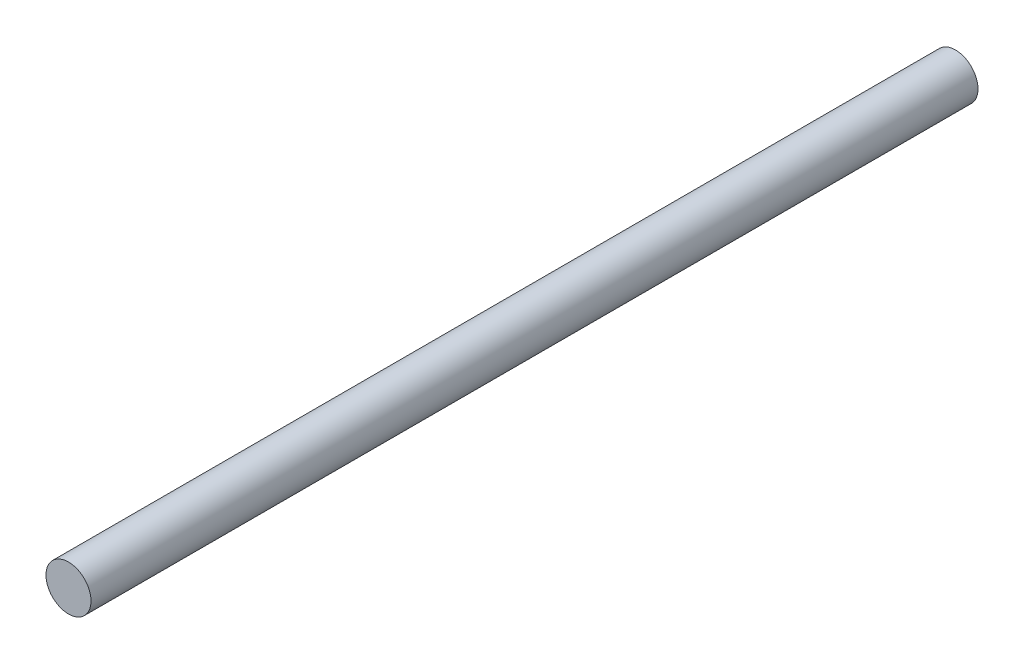
ISO-10303-21;
HEADER;
FILE_DESCRIPTION(('STEP AP214'),'2;1');
FILE_NAME('part.step','',(''),(''),'','','');
FILE_SCHEMA(('AUTOMOTIVE_DESIGN { 1 0 10303 214 1 1 1 1 }'));
ENDSEC;
DATA;
#1=APPLICATION_CONTEXT('core data for automotive mechanical design processes');
#2=APPLICATION_PROTOCOL_DEFINITION('international standard','automotive_design',2000,#1);
#3=PRODUCT_CONTEXT('',#1,'mechanical');
#4=PRODUCT('Part','Part','',(#3));
#5=PRODUCT_RELATED_PRODUCT_CATEGORY('part','',(#4));
#6=PRODUCT_DEFINITION_FORMATION('','',#4);
#7=PRODUCT_DEFINITION_CONTEXT('part definition',#1,'design');
#8=PRODUCT_DEFINITION('design','',#6,#7);
#9=PRODUCT_DEFINITION_SHAPE('','',#8);
#10=(LENGTH_UNIT() NAMED_UNIT(*) SI_UNIT(.MILLI.,.METRE.));
#11=(NAMED_UNIT(*) PLANE_ANGLE_UNIT() SI_UNIT($,.RADIAN.));
#12=(NAMED_UNIT(*) SI_UNIT($,.STERADIAN.) SOLID_ANGLE_UNIT());
#13=UNCERTAINTY_MEASURE_WITH_UNIT(LENGTH_MEASURE(1.E-05),#10,'distance_accuracy_value','');
#14=(GEOMETRIC_REPRESENTATION_CONTEXT(3) GLOBAL_UNCERTAINTY_ASSIGNED_CONTEXT((#13)) GLOBAL_UNIT_ASSIGNED_CONTEXT((#10,
#11,#12)) REPRESENTATION_CONTEXT('',''));
#15=CARTESIAN_POINT('',(0.,0.,0.));
#16=DIRECTION('',(0.,0.,1.));
#17=DIRECTION('',(1.,0.,0.));
#18=AXIS2_PLACEMENT_3D('',#15,#16,#17);
#19=CARTESIAN_POINT('',(0.,0.,250.));
#20=DIRECTION('',(0.,0.,-1.));
#21=DIRECTION('',(-1.,0.,0.));
#22=AXIS2_PLACEMENT_3D('',#19,#20,#21);
#23=CYLINDRICAL_SURFACE('',#22,6.35);
#24=CARTESIAN_POINT('',(0.,0.,250.));
#25=DIRECTION('',(0.,0.,1.));
#26=DIRECTION('',(1.,0.,0.));
#27=AXIS2_PLACEMENT_3D('',#24,#25,#26);
#28=CIRCLE('',#27,6.35);
#29=CARTESIAN_POINT('',(6.35,0.,250.));
#30=VERTEX_POINT('',#29);
#31=EDGE_CURVE('E10',#30,#30,#28,.T.);
#32=ORIENTED_EDGE('',*,*,#31,.F.);
#33=EDGE_LOOP('',(#32));
#34=FACE_BOUND('',#33,.T.);
#35=CARTESIAN_POINT('',(0.,0.,0.));
#36=DIRECTION('',(0.,0.,1.));
#37=DIRECTION('',(1.,0.,0.));
#38=AXIS2_PLACEMENT_3D('',#35,#36,#37);
#39=CIRCLE('',#38,6.35);
#40=CARTESIAN_POINT('',(6.35,0.,0.));
#41=VERTEX_POINT('',#40);
#42=EDGE_CURVE('E42',#41,#41,#39,.T.);
#43=ORIENTED_EDGE('',*,*,#42,.T.);
#44=EDGE_LOOP('',(#43));
#45=FACE_BOUND('',#44,.T.);
#46=ADVANCED_FACE('F39',(#34,#45),#23,.T.);
#47=CARTESIAN_POINT('',(0.,0.,250.));
#48=DIRECTION('',(0.,0.,1.));
#49=DIRECTION('',(1.,0.,0.));
#50=AXIS2_PLACEMENT_3D('',#47,#48,#49);
#51=PLANE('',#50);
#52=ORIENTED_EDGE('',*,*,#31,.T.);
#53=EDGE_LOOP('',(#52));
#54=FACE_BOUND('',#53,.T.);
#55=ADVANCED_FACE('F54',(#54),#51,.T.);
#56=CARTESIAN_POINT('',(0.,0.,0.));
#57=DIRECTION('',(0.,0.,1.));
#58=DIRECTION('',(1.,0.,0.));
#59=AXIS2_PLACEMENT_3D('',#56,#57,#58);
#60=PLANE('',#59);
#61=ORIENTED_EDGE('',*,*,#42,.F.);
#62=EDGE_LOOP('',(#61));
#63=FACE_BOUND('',#62,.T.);
#64=ADVANCED_FACE('F52',(#63),#60,.F.);
#65=CLOSED_SHELL('',(#46,#55,#64));
#66=MANIFOLD_SOLID_BREP('B2',#65);
#67=ADVANCED_BREP_SHAPE_REPRESENTATION('',(#18,#66),#14);
#68=SHAPE_DEFINITION_REPRESENTATION(#9,#67);
ENDSEC;
END-ISO-10303-21;
